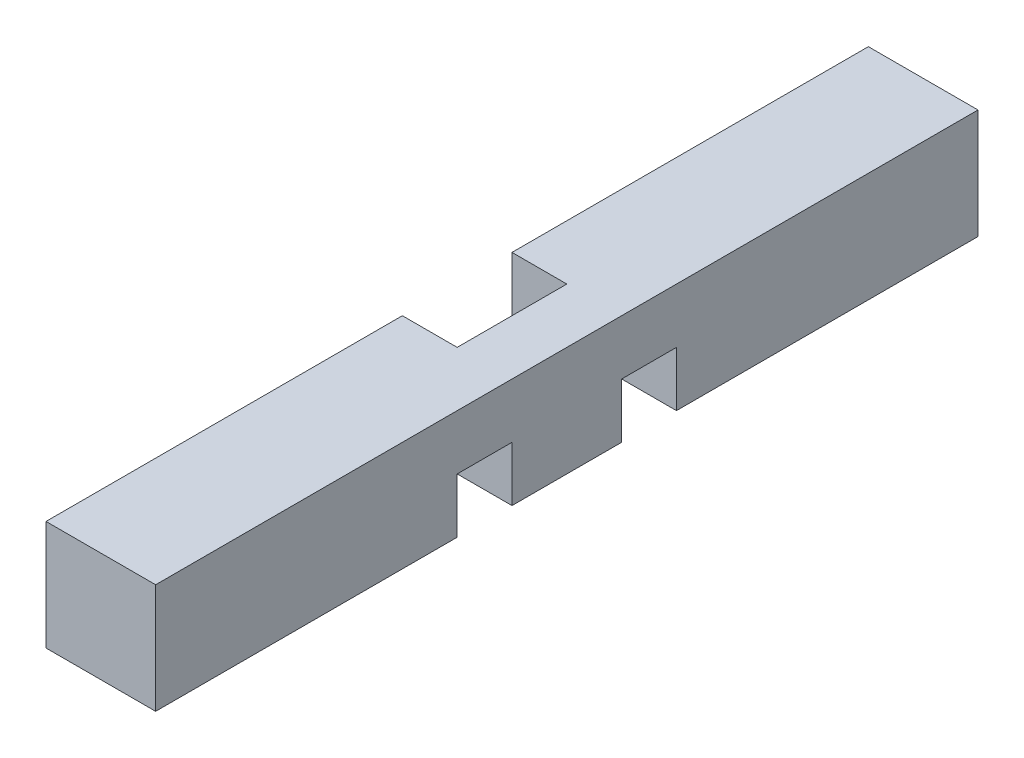
ISO-10303-21;
HEADER;
FILE_DESCRIPTION(('STEP AP214'),'2;1');
FILE_NAME('part.step','',(''),(''),'','','');
FILE_SCHEMA(('AUTOMOTIVE_DESIGN { 1 0 10303 214 1 1 1 1 }'));
ENDSEC;
DATA;
#1=APPLICATION_CONTEXT('core data for automotive mechanical design processes');
#2=APPLICATION_PROTOCOL_DEFINITION('international standard','automotive_design',2000,#1);
#3=PRODUCT_CONTEXT('',#1,'mechanical');
#4=PRODUCT('Part','Part','',(#3));
#5=PRODUCT_RELATED_PRODUCT_CATEGORY('part','',(#4));
#6=PRODUCT_DEFINITION_FORMATION('','',#4);
#7=PRODUCT_DEFINITION_CONTEXT('part definition',#1,'design');
#8=PRODUCT_DEFINITION('design','',#6,#7);
#9=PRODUCT_DEFINITION_SHAPE('','',#8);
#10=(LENGTH_UNIT() NAMED_UNIT(*) SI_UNIT(.MILLI.,.METRE.));
#11=(NAMED_UNIT(*) PLANE_ANGLE_UNIT() SI_UNIT($,.RADIAN.));
#12=(NAMED_UNIT(*) SI_UNIT($,.STERADIAN.) SOLID_ANGLE_UNIT());
#13=UNCERTAINTY_MEASURE_WITH_UNIT(LENGTH_MEASURE(1.E-05),#10,'distance_accuracy_value','');
#14=(GEOMETRIC_REPRESENTATION_CONTEXT(3) GLOBAL_UNCERTAINTY_ASSIGNED_CONTEXT((#13)) GLOBAL_UNIT_ASSIGNED_CONTEXT((#10,
#11,#12)) REPRESENTATION_CONTEXT('',''));
#15=CARTESIAN_POINT('',(0.,0.,0.));
#16=DIRECTION('',(0.,0.,1.));
#17=DIRECTION('',(1.,0.,0.));
#18=AXIS2_PLACEMENT_3D('',#15,#16,#17);
#19=CARTESIAN_POINT('',(-2.,2.,30.));
#20=DIRECTION('',(0.,1.,0.));
#21=DIRECTION('',(0.,0.,1.));
#22=AXIS2_PLACEMENT_3D('',#19,#20,#21);
#23=PLANE('',#22);
#24=DIRECTION('',(0.,0.,-1.));
#25=VECTOR('',#24,1.);
#26=CARTESIAN_POINT('',(-2.,2.,30.));
#27=LINE('',#26,#25);
#28=CARTESIAN_POINT('',(-2.,2.,13.));
#29=VERTEX_POINT('',#28);
#30=CARTESIAN_POINT('',(-2.,2.,0.));
#31=VERTEX_POINT('',#30);
#32=EDGE_CURVE('E43',#29,#31,#27,.T.);
#33=ORIENTED_EDGE('',*,*,#32,.F.);
#34=DIRECTION('',(-1.,0.,0.));
#35=VECTOR('',#34,1.);
#36=CARTESIAN_POINT('',(0.,2.,13.));
#37=LINE('',#36,#35);
#38=CARTESIAN_POINT('',(0.,2.,13.));
#39=VERTEX_POINT('',#38);
#40=EDGE_CURVE('E161',#39,#29,#37,.T.);
#41=ORIENTED_EDGE('',*,*,#40,.F.);
#42=DIRECTION('',(0.,0.,-1.));
#43=VECTOR('',#42,1.);
#44=CARTESIAN_POINT('',(0.,2.,17.));
#45=LINE('',#44,#43);
#46=CARTESIAN_POINT('',(0.,2.,17.));
#47=VERTEX_POINT('',#46);
#48=EDGE_CURVE('E152',#47,#39,#45,.T.);
#49=ORIENTED_EDGE('',*,*,#48,.F.);
#50=DIRECTION('',(-1.,0.,0.));
#51=VECTOR('',#50,1.);
#52=CARTESIAN_POINT('',(0.,2.,17.));
#53=LINE('',#52,#51);
#54=CARTESIAN_POINT('',(-2.,2.,17.));
#55=VERTEX_POINT('',#54);
#56=EDGE_CURVE('E173',#47,#55,#53,.T.);
#57=ORIENTED_EDGE('',*,*,#56,.T.);
#58=CARTESIAN_POINT('',(-2.,2.,30.));
#59=VERTEX_POINT('',#58);
#60=EDGE_CURVE('E11',#59,#55,#27,.T.);
#61=ORIENTED_EDGE('',*,*,#60,.F.);
#62=DIRECTION('',(1.,0.,0.));
#63=VECTOR('',#62,1.);
#64=CARTESIAN_POINT('',(-2.,2.,30.));
#65=LINE('',#64,#63);
#66=CARTESIAN_POINT('',(2.,2.,30.));
#67=VERTEX_POINT('',#66);
#68=EDGE_CURVE('E238',#59,#67,#65,.T.);
#69=ORIENTED_EDGE('',*,*,#68,.T.);
#70=DIRECTION('',(0.,0.,-1.));
#71=VECTOR('',#70,1.);
#72=CARTESIAN_POINT('',(2.,2.,30.));
#73=LINE('',#72,#71);
#74=CARTESIAN_POINT('',(2.,2.,0.));
#75=VERTEX_POINT('',#74);
#76=EDGE_CURVE('E38',#67,#75,#73,.T.);
#77=ORIENTED_EDGE('',*,*,#76,.T.);
#78=DIRECTION('',(1.,0.,0.));
#79=VECTOR('',#78,1.);
#80=CARTESIAN_POINT('',(-2.,2.,0.));
#81=LINE('',#80,#79);
#82=EDGE_CURVE('E230',#31,#75,#81,.T.);
#83=ORIENTED_EDGE('',*,*,#82,.F.);
#84=EDGE_LOOP('',(#33,#41,#49,#57,#61,#69,#77,#83));
#85=FACE_BOUND('',#84,.T.);
#86=ADVANCED_FACE('F35',(#85),#23,.T.);
#87=CARTESIAN_POINT('',(-2.,2.,30.));
#88=DIRECTION('',(1.,0.,0.));
#89=DIRECTION('',(0.,0.,-1.));
#90=AXIS2_PLACEMENT_3D('',#87,#88,#89);
#91=PLANE('',#90);
#92=DIRECTION('',(0.,-1.,0.));
#93=VECTOR('',#92,1.);
#94=CARTESIAN_POINT('',(-2.,2.,13.));
#95=LINE('',#94,#93);
#96=CARTESIAN_POINT('',(-2.,0.,13.));
#97=VERTEX_POINT('',#96);
#98=EDGE_CURVE('E170',#29,#97,#95,.T.);
#99=ORIENTED_EDGE('',*,*,#98,.F.);
#100=ORIENTED_EDGE('',*,*,#32,.T.);
#101=DIRECTION('',(0.,-1.,0.));
#102=VECTOR('',#101,1.);
#103=CARTESIAN_POINT('',(-2.,2.,0.));
#104=LINE('',#103,#102);
#105=CARTESIAN_POINT('',(-2.,-2.,0.));
#106=VERTEX_POINT('',#105);
#107=EDGE_CURVE('E241',#31,#106,#104,.T.);
#108=ORIENTED_EDGE('',*,*,#107,.T.);
#109=DIRECTION('',(0.,0.,-1.));
#110=VECTOR('',#109,1.);
#111=CARTESIAN_POINT('',(-2.,-2.,30.));
#112=LINE('',#111,#110);
#113=CARTESIAN_POINT('',(-2.,-2.,11.));
#114=VERTEX_POINT('',#113);
#115=EDGE_CURVE('E258',#114,#106,#112,.T.);
#116=ORIENTED_EDGE('',*,*,#115,.F.);
#117=DIRECTION('',(0.,1.,0.));
#118=VECTOR('',#117,1.);
#119=CARTESIAN_POINT('',(-2.,-2.,11.));
#120=LINE('',#119,#118);
#121=CARTESIAN_POINT('',(-2.,0.,11.));
#122=VERTEX_POINT('',#121);
#123=EDGE_CURVE('E219',#114,#122,#120,.T.);
#124=ORIENTED_EDGE('',*,*,#123,.T.);
#125=DIRECTION('',(0.,0.,-1.));
#126=VECTOR('',#125,1.);
#127=CARTESIAN_POINT('',(-2.,0.,19.));
#128=LINE('',#127,#126);
#129=EDGE_CURVE('E222',#97,#122,#128,.T.);
#130=ORIENTED_EDGE('',*,*,#129,.F.);
#131=EDGE_LOOP('',(#99,#100,#108,#116,#124,#130));
#132=FACE_BOUND('',#131,.T.);
#133=ADVANCED_FACE('F272',(#132),#91,.F.);
#134=CARTESIAN_POINT('',(0.,0.,19.));
#135=DIRECTION('',(0.,1.,0.));
#136=DIRECTION('',(0.,0.,1.));
#137=AXIS2_PLACEMENT_3D('',#134,#135,#136);
#138=PLANE('',#137);
#139=DIRECTION('',(-1.,0.,0.));
#140=VECTOR('',#139,1.);
#141=CARTESIAN_POINT('',(0.,0.,13.));
#142=LINE('',#141,#140);
#143=CARTESIAN_POINT('',(0.,0.,13.));
#144=VERTEX_POINT('',#143);
#145=EDGE_CURVE('E167',#144,#97,#142,.T.);
#146=ORIENTED_EDGE('',*,*,#145,.T.);
#147=ORIENTED_EDGE('',*,*,#129,.T.);
#148=DIRECTION('',(-1.,0.,0.));
#149=VECTOR('',#148,1.);
#150=CARTESIAN_POINT('',(0.,0.,11.));
#151=LINE('',#150,#149);
#152=CARTESIAN_POINT('',(2.,0.,11.));
#153=VERTEX_POINT('',#152);
#154=EDGE_CURVE('E234',#153,#122,#151,.T.);
#155=ORIENTED_EDGE('',*,*,#154,.F.);
#156=DIRECTION('',(0.,0.,-1.));
#157=VECTOR('',#156,1.);
#158=CARTESIAN_POINT('',(2.,0.,11.));
#159=LINE('',#158,#157);
#160=CARTESIAN_POINT('',(2.,0.,13.));
#161=VERTEX_POINT('',#160);
#162=EDGE_CURVE('E190',#161,#153,#159,.T.);
#163=ORIENTED_EDGE('',*,*,#162,.F.);
#164=DIRECTION('',(-1.,0.,0.));
#165=VECTOR('',#164,1.);
#166=CARTESIAN_POINT('',(2.,0.,13.));
#167=LINE('',#166,#165);
#168=EDGE_CURVE('E194',#161,#144,#167,.T.);
#169=ORIENTED_EDGE('',*,*,#168,.T.);
#170=EDGE_LOOP('',(#146,#147,#155,#163,#169));
#171=FACE_BOUND('',#170,.T.);
#172=ADVANCED_FACE('F281',(#171),#138,.F.);
#173=CARTESIAN_POINT('',(-2.,-2.,30.));
#174=DIRECTION('',(0.,1.,0.));
#175=DIRECTION('',(0.,0.,1.));
#176=AXIS2_PLACEMENT_3D('',#173,#174,#175);
#177=PLANE('',#176);
#178=DIRECTION('',(0.,0.,-1.));
#179=VECTOR('',#178,1.);
#180=CARTESIAN_POINT('',(2.,-2.,30.));
#181=LINE('',#180,#179);
#182=CARTESIAN_POINT('',(2.,-2.,11.));
#183=VERTEX_POINT('',#182);
#184=CARTESIAN_POINT('',(2.,-2.,0.));
#185=VERTEX_POINT('',#184);
#186=EDGE_CURVE('E262',#183,#185,#181,.T.);
#187=ORIENTED_EDGE('',*,*,#186,.F.);
#188=DIRECTION('',(-1.,0.,0.));
#189=VECTOR('',#188,1.);
#190=CARTESIAN_POINT('',(0.,-2.,11.));
#191=LINE('',#190,#189);
#192=EDGE_CURVE('E231',#183,#114,#191,.T.);
#193=ORIENTED_EDGE('',*,*,#192,.T.);
#194=ORIENTED_EDGE('',*,*,#115,.T.);
#195=DIRECTION('',(1.,0.,0.));
#196=VECTOR('',#195,1.);
#197=CARTESIAN_POINT('',(-2.,-2.,0.));
#198=LINE('',#197,#196);
#199=EDGE_CURVE('E252',#106,#185,#198,.T.);
#200=ORIENTED_EDGE('',*,*,#199,.T.);
#201=EDGE_LOOP('',(#187,#193,#194,#200));
#202=FACE_BOUND('',#201,.T.);
#203=ADVANCED_FACE('F275',(#202),#177,.F.);
#204=DIRECTION('',(-1.,0.,0.));
#205=VECTOR('',#204,1.);
#206=CARTESIAN_POINT('',(0.,-2.,19.));
#207=LINE('',#206,#205);
#208=CARTESIAN_POINT('',(2.,-2.,19.));
#209=VERTEX_POINT('',#208);
#210=CARTESIAN_POINT('',(-2.,-2.,19.));
#211=VERTEX_POINT('',#210);
#212=EDGE_CURVE('E228',#209,#211,#207,.T.);
#213=ORIENTED_EDGE('',*,*,#212,.F.);
#214=CARTESIAN_POINT('',(2.,-2.,30.));
#215=VERTEX_POINT('',#214);
#216=EDGE_CURVE('E259',#215,#209,#181,.T.);
#217=ORIENTED_EDGE('',*,*,#216,.F.);
#218=DIRECTION('',(1.,0.,0.));
#219=VECTOR('',#218,1.);
#220=CARTESIAN_POINT('',(-2.,-2.,30.));
#221=LINE('',#220,#219);
#222=CARTESIAN_POINT('',(-2.,-2.,30.));
#223=VERTEX_POINT('',#222);
#224=EDGE_CURVE('E243',#223,#215,#221,.T.);
#225=ORIENTED_EDGE('',*,*,#224,.F.);
#226=EDGE_CURVE('E256',#223,#211,#112,.T.);
#227=ORIENTED_EDGE('',*,*,#226,.T.);
#228=EDGE_LOOP('',(#213,#217,#225,#227));
#229=FACE_BOUND('',#228,.T.);
#230=ADVANCED_FACE('F306',(#229),#177,.F.);
#231=ORIENTED_EDGE('',*,*,#60,.T.);
#232=DIRECTION('',(0.,-1.,0.));
#233=VECTOR('',#232,1.);
#234=CARTESIAN_POINT('',(-2.,2.,17.));
#235=LINE('',#234,#233);
#236=CARTESIAN_POINT('',(-2.,0.,17.));
#237=VERTEX_POINT('',#236);
#238=EDGE_CURVE('E180',#55,#237,#235,.T.);
#239=ORIENTED_EDGE('',*,*,#238,.T.);
#240=CARTESIAN_POINT('',(-2.,0.,19.));
#241=VERTEX_POINT('',#240);
#242=EDGE_CURVE('E223',#241,#237,#128,.T.);
#243=ORIENTED_EDGE('',*,*,#242,.F.);
#244=DIRECTION('',(0.,1.,0.));
#245=VECTOR('',#244,1.);
#246=CARTESIAN_POINT('',(-2.,-2.,19.));
#247=LINE('',#246,#245);
#248=EDGE_CURVE('E212',#211,#241,#247,.T.);
#249=ORIENTED_EDGE('',*,*,#248,.F.);
#250=ORIENTED_EDGE('',*,*,#226,.F.);
#251=DIRECTION('',(0.,-1.,0.));
#252=VECTOR('',#251,1.);
#253=CARTESIAN_POINT('',(-2.,2.,30.));
#254=LINE('',#253,#252);
#255=EDGE_CURVE('E245',#59,#223,#254,.T.);
#256=ORIENTED_EDGE('',*,*,#255,.F.);
#257=EDGE_LOOP('',(#231,#239,#243,#249,#250,#256));
#258=FACE_BOUND('',#257,.T.);
#259=ADVANCED_FACE('F299',(#258),#91,.F.);
#260=DIRECTION('',(0.,0.,-1.));
#261=VECTOR('',#260,1.);
#262=CARTESIAN_POINT('',(0.,-2.,19.));
#263=LINE('',#262,#261);
#264=CARTESIAN_POINT('',(0.,-2.,17.));
#265=VERTEX_POINT('',#264);
#266=CARTESIAN_POINT('',(0.,-2.,13.));
#267=VERTEX_POINT('',#266);
#268=EDGE_CURVE('E215',#265,#267,#263,.T.);
#269=ORIENTED_EDGE('',*,*,#268,.T.);
#270=DIRECTION('',(-1.,0.,0.));
#271=VECTOR('',#270,1.);
#272=CARTESIAN_POINT('',(2.,-2.,13.));
#273=LINE('',#272,#271);
#274=CARTESIAN_POINT('',(2.,-2.,13.));
#275=VERTEX_POINT('',#274);
#276=EDGE_CURVE('E51',#275,#267,#273,.T.);
#277=ORIENTED_EDGE('',*,*,#276,.F.);
#278=CARTESIAN_POINT('',(2.,-2.,17.));
#279=VERTEX_POINT('',#278);
#280=EDGE_CURVE('E261',#279,#275,#181,.T.);
#281=ORIENTED_EDGE('',*,*,#280,.F.);
#282=DIRECTION('',(-1.,0.,0.));
#283=VECTOR('',#282,1.);
#284=CARTESIAN_POINT('',(2.,-2.,17.));
#285=LINE('',#284,#283);
#286=EDGE_CURVE('E209',#279,#265,#285,.T.);
#287=ORIENTED_EDGE('',*,*,#286,.T.);
#288=EDGE_LOOP('',(#269,#277,#281,#287));
#289=FACE_BOUND('',#288,.T.);
#290=ADVANCED_FACE('F285',(#289),#177,.F.);
#291=CARTESIAN_POINT('',(2.,2.,30.));
#292=DIRECTION('',(1.,0.,0.));
#293=DIRECTION('',(0.,0.,-1.));
#294=AXIS2_PLACEMENT_3D('',#291,#292,#293);
#295=PLANE('',#294);
#296=DIRECTION('',(0.,-1.,0.));
#297=VECTOR('',#296,1.);
#298=CARTESIAN_POINT('',(2.,-2.,11.));
#299=LINE('',#298,#297);
#300=EDGE_CURVE('E184',#153,#183,#299,.T.);
#301=ORIENTED_EDGE('',*,*,#300,.T.);
#302=ORIENTED_EDGE('',*,*,#186,.T.);
#303=DIRECTION('',(0.,-1.,0.));
#304=VECTOR('',#303,1.);
#305=CARTESIAN_POINT('',(2.,2.,0.));
#306=LINE('',#305,#304);
#307=EDGE_CURVE('E249',#75,#185,#306,.T.);
#308=ORIENTED_EDGE('',*,*,#307,.F.);
#309=ORIENTED_EDGE('',*,*,#76,.F.);
#310=DIRECTION('',(0.,-1.,0.));
#311=VECTOR('',#310,1.);
#312=CARTESIAN_POINT('',(2.,2.,30.));
#313=LINE('',#312,#311);
#314=EDGE_CURVE('E240',#67,#215,#313,.T.);
#315=ORIENTED_EDGE('',*,*,#314,.T.);
#316=ORIENTED_EDGE('',*,*,#216,.T.);
#317=DIRECTION('',(0.,1.,0.));
#318=VECTOR('',#317,1.);
#319=CARTESIAN_POINT('',(2.,-2.,19.));
#320=LINE('',#319,#318);
#321=CARTESIAN_POINT('',(2.,0.,19.));
#322=VERTEX_POINT('',#321);
#323=EDGE_CURVE('E198',#209,#322,#320,.T.);
#324=ORIENTED_EDGE('',*,*,#323,.T.);
#325=DIRECTION('',(0.,0.,-1.));
#326=VECTOR('',#325,1.);
#327=CARTESIAN_POINT('',(2.,0.,19.));
#328=LINE('',#327,#326);
#329=CARTESIAN_POINT('',(2.,0.,17.));
#330=VERTEX_POINT('',#329);
#331=EDGE_CURVE('E201',#322,#330,#328,.T.);
#332=ORIENTED_EDGE('',*,*,#331,.T.);
#333=DIRECTION('',(0.,-1.,0.));
#334=VECTOR('',#333,1.);
#335=CARTESIAN_POINT('',(2.,-2.,17.));
#336=LINE('',#335,#334);
#337=EDGE_CURVE('E204',#330,#279,#336,.T.);
#338=ORIENTED_EDGE('',*,*,#337,.T.);
#339=ORIENTED_EDGE('',*,*,#280,.T.);
#340=DIRECTION('',(0.,1.,0.));
#341=VECTOR('',#340,1.);
#342=CARTESIAN_POINT('',(2.,-2.,13.));
#343=LINE('',#342,#341);
#344=EDGE_CURVE('E187',#275,#161,#343,.T.);
#345=ORIENTED_EDGE('',*,*,#344,.T.);
#346=ORIENTED_EDGE('',*,*,#162,.T.);
#347=EDGE_LOOP('',(#301,#302,#308,#309,#315,#316,#324,#332,#338,#339,#345,#346));
#348=FACE_BOUND('',#347,.T.);
#349=ADVANCED_FACE('F267',(#348),#295,.T.);
#350=CARTESIAN_POINT('',(0.,0.,30.));
#351=DIRECTION('',(0.,0.,-1.));
#352=DIRECTION('',(-1.,0.,0.));
#353=AXIS2_PLACEMENT_3D('',#350,#351,#352);
#354=PLANE('',#353);
#355=ORIENTED_EDGE('',*,*,#68,.F.);
#356=ORIENTED_EDGE('',*,*,#255,.T.);
#357=ORIENTED_EDGE('',*,*,#224,.T.);
#358=ORIENTED_EDGE('',*,*,#314,.F.);
#359=EDGE_LOOP('',(#355,#356,#357,#358));
#360=FACE_BOUND('',#359,.T.);
#361=ADVANCED_FACE('F304',(#360),#354,.F.);
#362=CARTESIAN_POINT('',(0.,0.,0.));
#363=DIRECTION('',(0.,0.,-1.));
#364=DIRECTION('',(-1.,0.,0.));
#365=AXIS2_PLACEMENT_3D('',#362,#363,#364);
#366=PLANE('',#365);
#367=ORIENTED_EDGE('',*,*,#82,.T.);
#368=ORIENTED_EDGE('',*,*,#307,.T.);
#369=ORIENTED_EDGE('',*,*,#199,.F.);
#370=ORIENTED_EDGE('',*,*,#107,.F.);
#371=EDGE_LOOP('',(#367,#368,#369,#370));
#372=FACE_BOUND('',#371,.T.);
#373=ADVANCED_FACE('F270',(#372),#366,.T.);
#374=CARTESIAN_POINT('',(0.,-2.,19.));
#375=DIRECTION('',(0.,0.,1.));
#376=DIRECTION('',(1.,0.,0.));
#377=AXIS2_PLACEMENT_3D('',#374,#375,#376);
#378=PLANE('',#377);
#379=ORIENTED_EDGE('',*,*,#248,.T.);
#380=DIRECTION('',(-1.,0.,0.));
#381=VECTOR('',#380,1.);
#382=CARTESIAN_POINT('',(0.,0.,19.));
#383=LINE('',#382,#381);
#384=EDGE_CURVE('E218',#322,#241,#383,.T.);
#385=ORIENTED_EDGE('',*,*,#384,.F.);
#386=ORIENTED_EDGE('',*,*,#323,.F.);
#387=ORIENTED_EDGE('',*,*,#212,.T.);
#388=EDGE_LOOP('',(#379,#385,#386,#387));
#389=FACE_BOUND('',#388,.T.);
#390=ADVANCED_FACE('F308',(#389),#378,.F.);
#391=CARTESIAN_POINT('',(0.,-2.,11.));
#392=DIRECTION('',(0.,0.,1.));
#393=DIRECTION('',(1.,0.,0.));
#394=AXIS2_PLACEMENT_3D('',#391,#392,#393);
#395=PLANE('',#394);
#396=ORIENTED_EDGE('',*,*,#123,.F.);
#397=ORIENTED_EDGE('',*,*,#192,.F.);
#398=ORIENTED_EDGE('',*,*,#300,.F.);
#399=ORIENTED_EDGE('',*,*,#154,.T.);
#400=EDGE_LOOP('',(#396,#397,#398,#399));
#401=FACE_BOUND('',#400,.T.);
#402=ADVANCED_FACE('F278',(#401),#395,.T.);
#403=ORIENTED_EDGE('',*,*,#242,.T.);
#404=DIRECTION('',(-1.,0.,0.));
#405=VECTOR('',#404,1.);
#406=CARTESIAN_POINT('',(0.,0.,17.));
#407=LINE('',#406,#405);
#408=CARTESIAN_POINT('',(0.,0.,17.));
#409=VERTEX_POINT('',#408);
#410=EDGE_CURVE('E162',#409,#237,#407,.T.);
#411=ORIENTED_EDGE('',*,*,#410,.F.);
#412=DIRECTION('',(-1.,0.,0.));
#413=VECTOR('',#412,1.);
#414=CARTESIAN_POINT('',(2.,0.,17.));
#415=LINE('',#414,#413);
#416=EDGE_CURVE('E207',#330,#409,#415,.T.);
#417=ORIENTED_EDGE('',*,*,#416,.F.);
#418=ORIENTED_EDGE('',*,*,#331,.F.);
#419=ORIENTED_EDGE('',*,*,#384,.T.);
#420=EDGE_LOOP('',(#403,#411,#417,#418,#419));
#421=FACE_BOUND('',#420,.T.);
#422=ADVANCED_FACE('F293',(#421),#138,.F.);
#423=CARTESIAN_POINT('',(0.,0.,0.));
#424=DIRECTION('',(-1.,0.,0.));
#425=DIRECTION('',(0.,0.,1.));
#426=AXIS2_PLACEMENT_3D('',#423,#424,#425);
#427=PLANE('',#426);
#428=DIRECTION('',(0.,1.,0.));
#429=VECTOR('',#428,1.);
#430=CARTESIAN_POINT('',(0.,-2.,13.));
#431=LINE('',#430,#429);
#432=EDGE_CURVE('E169',#267,#144,#431,.T.);
#433=ORIENTED_EDGE('',*,*,#432,.F.);
#434=ORIENTED_EDGE('',*,*,#268,.F.);
#435=DIRECTION('',(0.,-1.,0.));
#436=VECTOR('',#435,1.);
#437=CARTESIAN_POINT('',(0.,-2.,17.));
#438=LINE('',#437,#436);
#439=EDGE_CURVE('E196',#409,#265,#438,.T.);
#440=ORIENTED_EDGE('',*,*,#439,.F.);
#441=DIRECTION('',(0.,-1.,0.));
#442=VECTOR('',#441,1.);
#443=CARTESIAN_POINT('',(0.,2.,17.));
#444=LINE('',#443,#442);
#445=EDGE_CURVE('E158',#47,#409,#444,.T.);
#446=ORIENTED_EDGE('',*,*,#445,.F.);
#447=ORIENTED_EDGE('',*,*,#48,.T.);
#448=DIRECTION('',(0.,-1.,0.));
#449=VECTOR('',#448,1.);
#450=CARTESIAN_POINT('',(0.,2.,13.));
#451=LINE('',#450,#449);
#452=EDGE_CURVE('E155',#39,#144,#451,.T.);
#453=ORIENTED_EDGE('',*,*,#452,.T.);
#454=EDGE_LOOP('',(#433,#434,#440,#446,#447,#453));
#455=FACE_BOUND('',#454,.T.);
#456=ADVANCED_FACE('F154',(#455),#427,.T.);
#457=CARTESIAN_POINT('',(2.,-2.,17.));
#458=DIRECTION('',(0.,0.,-1.));
#459=DIRECTION('',(-1.,0.,0.));
#460=AXIS2_PLACEMENT_3D('',#457,#458,#459);
#461=PLANE('',#460);
#462=ORIENTED_EDGE('',*,*,#439,.T.);
#463=ORIENTED_EDGE('',*,*,#286,.F.);
#464=ORIENTED_EDGE('',*,*,#337,.F.);
#465=ORIENTED_EDGE('',*,*,#416,.T.);
#466=EDGE_LOOP('',(#462,#463,#464,#465));
#467=FACE_BOUND('',#466,.T.);
#468=ADVANCED_FACE('F289',(#467),#461,.F.);
#469=CARTESIAN_POINT('',(2.,-2.,13.));
#470=DIRECTION('',(0.,0.,1.));
#471=DIRECTION('',(1.,0.,0.));
#472=AXIS2_PLACEMENT_3D('',#469,#470,#471);
#473=PLANE('',#472);
#474=ORIENTED_EDGE('',*,*,#432,.T.);
#475=ORIENTED_EDGE('',*,*,#168,.F.);
#476=ORIENTED_EDGE('',*,*,#344,.F.);
#477=ORIENTED_EDGE('',*,*,#276,.T.);
#478=EDGE_LOOP('',(#474,#475,#476,#477));
#479=FACE_BOUND('',#478,.T.);
#480=ADVANCED_FACE('F282',(#479),#473,.F.);
#481=CARTESIAN_POINT('',(0.,2.,13.));
#482=DIRECTION('',(0.,0.,1.));
#483=DIRECTION('',(0.,-1.,0.));
#484=AXIS2_PLACEMENT_3D('',#481,#482,#483);
#485=PLANE('',#484);
#486=ORIENTED_EDGE('',*,*,#145,.F.);
#487=ORIENTED_EDGE('',*,*,#452,.F.);
#488=ORIENTED_EDGE('',*,*,#40,.T.);
#489=ORIENTED_EDGE('',*,*,#98,.T.);
#490=EDGE_LOOP('',(#486,#487,#488,#489));
#491=FACE_BOUND('',#490,.T.);
#492=ADVANCED_FACE('F165',(#491),#485,.T.);
#493=CARTESIAN_POINT('',(0.,2.,17.));
#494=DIRECTION('',(0.,0.,1.));
#495=DIRECTION('',(0.,-1.,0.));
#496=AXIS2_PLACEMENT_3D('',#493,#494,#495);
#497=PLANE('',#496);
#498=ORIENTED_EDGE('',*,*,#410,.T.);
#499=ORIENTED_EDGE('',*,*,#238,.F.);
#500=ORIENTED_EDGE('',*,*,#56,.F.);
#501=ORIENTED_EDGE('',*,*,#445,.T.);
#502=EDGE_LOOP('',(#498,#499,#500,#501));
#503=FACE_BOUND('',#502,.T.);
#504=ADVANCED_FACE('F297',(#503),#497,.F.);
#505=CLOSED_SHELL('',(#86,#133,#172,#203,#230,#259,#290,#349,#361,#373,#390,#402,#422,#456,#468,
#480,#492,#504));
#506=MANIFOLD_SOLID_BREP('B2',#505);
#507=ADVANCED_BREP_SHAPE_REPRESENTATION('',(#18,#506),#14);
#508=SHAPE_DEFINITION_REPRESENTATION(#9,#507);
ENDSEC;
END-ISO-10303-21;
